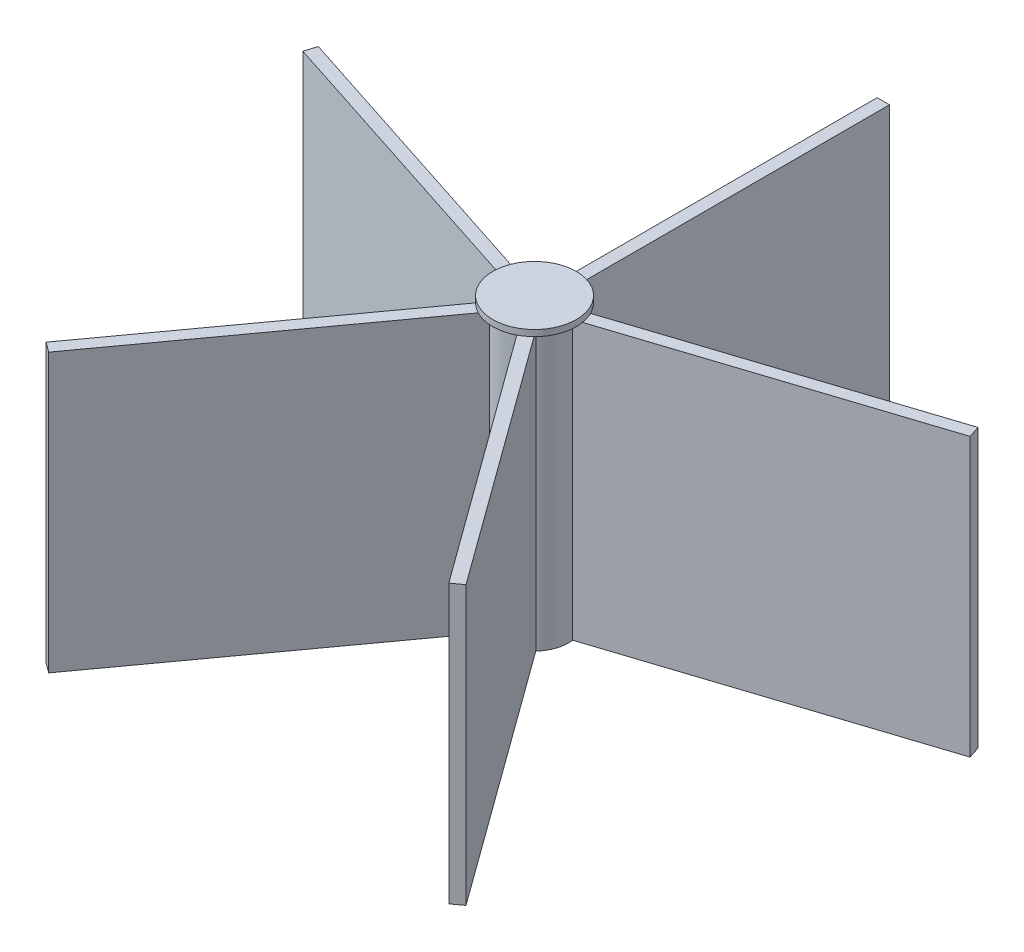
ISO-10303-21;
HEADER;
FILE_DESCRIPTION(('STEP AP214'),'2;1');
FILE_NAME('part.step','',(''),(''),'','','');
FILE_SCHEMA(('AUTOMOTIVE_DESIGN { 1 0 10303 214 1 1 1 1 }'));
ENDSEC;
DATA;
#1=APPLICATION_CONTEXT('core data for automotive mechanical design processes');
#2=APPLICATION_PROTOCOL_DEFINITION('international standard','automotive_design',2000,#1);
#3=PRODUCT_CONTEXT('',#1,'mechanical');
#4=PRODUCT('Part','Part','',(#3));
#5=PRODUCT_RELATED_PRODUCT_CATEGORY('part','',(#4));
#6=PRODUCT_DEFINITION_FORMATION('','',#4);
#7=PRODUCT_DEFINITION_CONTEXT('part definition',#1,'design');
#8=PRODUCT_DEFINITION('design','',#6,#7);
#9=PRODUCT_DEFINITION_SHAPE('','',#8);
#10=(LENGTH_UNIT() NAMED_UNIT(*) SI_UNIT(.MILLI.,.METRE.));
#11=(NAMED_UNIT(*) PLANE_ANGLE_UNIT() SI_UNIT($,.RADIAN.));
#12=(NAMED_UNIT(*) SI_UNIT($,.STERADIAN.) SOLID_ANGLE_UNIT());
#13=UNCERTAINTY_MEASURE_WITH_UNIT(LENGTH_MEASURE(1.E-05),#10,'distance_accuracy_value','');
#14=(GEOMETRIC_REPRESENTATION_CONTEXT(3) GLOBAL_UNCERTAINTY_ASSIGNED_CONTEXT((#13)) GLOBAL_UNIT_ASSIGNED_CONTEXT((#10,
#11,#12)) REPRESENTATION_CONTEXT('',''));
#15=CARTESIAN_POINT('',(0.,0.,0.));
#16=DIRECTION('',(0.,0.,1.));
#17=DIRECTION('',(1.,0.,0.));
#18=AXIS2_PLACEMENT_3D('',#15,#16,#17);
#19=CARTESIAN_POINT('',(0.,56.1860321366573,0.));
#20=DIRECTION('',(0.,1.,0.));
#21=DIRECTION('',(0.,0.,1.));
#22=AXIS2_PLACEMENT_3D('',#19,#20,#21);
#23=PLANE('',#22);
#24=DIRECTION('',(0.587785252292477,0.,0.809016994374944));
#25=VECTOR('',#24,1.);
#26=CARTESIAN_POINT('',(5.18107594453654,56.1860321366573,4.5791868335922));
#27=LINE('',#26,#25);
#28=CARTESIAN_POINT('',(5.98192769029197,56.1860321366573,5.68146469742774));
#29=VERTEX_POINT('',#28);
#30=CARTESIAN_POINT('',(7.10767356079731,56.1860321366573,7.23092096063636));
#31=VERTEX_POINT('',#30);
#32=EDGE_CURVE('E351',#29,#31,#27,.T.);
#33=ORIENTED_EDGE('',*,*,#32,.F.);
#34=CARTESIAN_POINT('',(0.,56.1860321366573,0.));
#35=DIRECTION('',(0.,1.,0.));
#36=DIRECTION('',(0.,0.,1.));
#37=AXIS2_PLACEMENT_3D('',#34,#35,#36);
#38=CIRCLE('',#37,8.25);
#39=CARTESIAN_POINT('',(8.17896232113662,56.1860321366573,-1.08031261652669));
#40=VERTEX_POINT('',#39);
#41=EDGE_CURVE('E273',#29,#40,#38,.T.);
#42=ORIENTED_EDGE('',*,*,#41,.T.);
#43=DIRECTION('',(0.951056516295153,0.,-0.309016994374949));
#44=VECTOR('',#43,1.);
#45=CARTESIAN_POINT('',(6.88315697655467,56.1860321366573,-0.65927993758815));
#46=LINE('',#45,#44);
#47=CARTESIAN_POINT('',(10.0004574023091,56.1860321366573,-1.67215224499099));
#48=VERTEX_POINT('',#47);
#49=EDGE_CURVE('E381',#40,#48,#46,.T.);
#50=ORIENTED_EDGE('',*,*,#49,.T.);
#51=CARTESIAN_POINT('',(0.,56.1860321366573,0.));
#52=DIRECTION('',(0.,1.,0.));
#53=DIRECTION('',(0.,0.,1.));
#54=AXIS2_PLACEMENT_3D('',#51,#52,#53);
#55=CIRCLE('',#54,10.1392919568295);
#56=EDGE_CURVE('E267',#31,#48,#55,.T.);
#57=ORIENTED_EDGE('',*,*,#56,.F.);
#58=EDGE_LOOP('',(#33,#42,#50,#57));
#59=FACE_BOUND('',#58,.T.);
#60=ADVANCED_FACE('F49',(#59),#23,.F.);
#61=DIRECTION('',(0.,0.,-1.));
#62=VECTOR('',#61,1.);
#63=CARTESIAN_POINT('',(-1.50000000000004,56.1860321366573,-6.75));
#64=LINE('',#63,#62);
#65=CARTESIAN_POINT('',(-1.50000000000004,56.1860321366573,-8.11249036979398));
#66=VERTEX_POINT('',#65);
#67=CARTESIAN_POINT('',(-1.50000000000004,56.1860321366573,-10.0277236392826));
#68=VERTEX_POINT('',#67);
#69=EDGE_CURVE('E430',#66,#68,#64,.T.);
#70=ORIENTED_EDGE('',*,*,#69,.F.);
#71=CARTESIAN_POINT('',(-7.25191133801183,56.1860321366573,-3.93348216541224));
#72=VERTEX_POINT('',#71);
#73=EDGE_CURVE('E518',#66,#72,#38,.T.);
#74=ORIENTED_EDGE('',*,*,#73,.T.);
#75=DIRECTION('',(-0.951056516295155,0.,-0.309016994374945));
#76=VECTOR('',#75,1.);
#77=CARTESIAN_POINT('',(-5.95610599342989,56.1860321366573,-3.5124494864737));
#78=LINE('',#77,#76);
#79=CARTESIAN_POINT('',(-9.07340641918431,56.1860321366573,-4.52532179387653));
#80=VERTEX_POINT('',#79);
#81=EDGE_CURVE('E274',#72,#80,#78,.T.);
#82=ORIENTED_EDGE('',*,*,#81,.T.);
#83=EDGE_CURVE('E248',#68,#80,#55,.T.);
#84=ORIENTED_EDGE('',*,*,#83,.F.);
#85=EDGE_LOOP('',(#70,#74,#82,#84));
#86=FACE_BOUND('',#85,.T.);
#87=ADVANCED_FACE('F567',(#86),#23,.F.);
#88=CARTESIAN_POINT('',(7.25191133801178,56.1860321366573,-3.93348216541216));
#89=VERTEX_POINT('',#88);
#90=CARTESIAN_POINT('',(1.49999999999996,56.1860321366573,-8.11249036979398));
#91=VERTEX_POINT('',#90);
#92=EDGE_CURVE('E521',#89,#91,#38,.T.);
#93=ORIENTED_EDGE('',*,*,#92,.T.);
#94=DIRECTION('',(0.,0.,-1.));
#95=VECTOR('',#94,1.);
#96=CARTESIAN_POINT('',(1.49999999999996,56.1860321366573,-6.75));
#97=LINE('',#96,#95);
#98=CARTESIAN_POINT('',(1.49999999999996,56.1860321366573,-10.0277236392826));
#99=VERTEX_POINT('',#98);
#100=EDGE_CURVE('E421',#91,#99,#97,.T.);
#101=ORIENTED_EDGE('',*,*,#100,.T.);
#102=CARTESIAN_POINT('',(9.07340641918426,56.1860321366573,-4.52532179387645));
#103=VERTEX_POINT('',#102);
#104=EDGE_CURVE('E261',#103,#99,#55,.T.);
#105=ORIENTED_EDGE('',*,*,#104,.F.);
#106=DIRECTION('',(0.951056516295153,0.,-0.309016994374949));
#107=VECTOR('',#106,1.);
#108=CARTESIAN_POINT('',(5.95610599342983,56.1860321366573,-3.51244948647361));
#109=LINE('',#108,#107);
#110=EDGE_CURVE('E391',#89,#103,#109,.T.);
#111=ORIENTED_EDGE('',*,*,#110,.F.);
#112=EDGE_LOOP('',(#93,#101,#105,#111));
#113=FACE_BOUND('',#112,.T.);
#114=ADVANCED_FACE('F534',(#113),#23,.F.);
#115=CARTESIAN_POINT('',(-3.55487670716728,56.1860321366573,7.44482045430511));
#116=VERTEX_POINT('',#115);
#117=CARTESIAN_POINT('',(3.55487670716712,56.1860321366573,7.44482045430515));
#118=VERTEX_POINT('',#117);
#119=EDGE_CURVE('E272',#116,#118,#38,.T.);
#120=ORIENTED_EDGE('',*,*,#119,.T.);
#121=DIRECTION('',(0.587785252292477,0.,0.809016994374944));
#122=VECTOR('',#121,1.);
#123=CARTESIAN_POINT('',(2.7540249614117,56.1860321366573,6.34254259046963));
#124=LINE('',#123,#122);
#125=CARTESIAN_POINT('',(4.68062257767247,56.1860321366573,8.99427671751377));
#126=VERTEX_POINT('',#125);
#127=EDGE_CURVE('E341',#118,#126,#124,.T.);
#128=ORIENTED_EDGE('',*,*,#127,.T.);
#129=CARTESIAN_POINT('',(-4.68062257767261,56.1860321366573,8.99427671751375));
#130=VERTEX_POINT('',#129);
#131=EDGE_CURVE('E268',#130,#126,#55,.T.);
#132=ORIENTED_EDGE('',*,*,#131,.F.);
#133=DIRECTION('',(-0.587785252292469,0.,0.809016994374951));
#134=VECTOR('',#133,1.);
#135=CARTESIAN_POINT('',(-2.75402496141186,56.1860321366573,6.34254259046956));
#136=LINE('',#135,#134);
#137=EDGE_CURVE('E311',#116,#130,#136,.T.);
#138=ORIENTED_EDGE('',*,*,#137,.F.);
#139=EDGE_LOOP('',(#120,#128,#132,#138));
#140=FACE_BOUND('',#139,.T.);
#141=ADVANCED_FACE('F501',(#140),#23,.F.);
#142=CARTESIAN_POINT('',(-8.17896232113669,56.1860321366573,-1.08031261652678));
#143=VERTEX_POINT('',#142);
#144=CARTESIAN_POINT('',(-5.98192769029211,56.1860321366573,5.68146469742768));
#145=VERTEX_POINT('',#144);
#146=EDGE_CURVE('E269',#143,#145,#38,.T.);
#147=ORIENTED_EDGE('',*,*,#146,.T.);
#148=DIRECTION('',(-0.587785252292469,0.,0.809016994374951));
#149=VECTOR('',#148,1.);
#150=CARTESIAN_POINT('',(-5.18107594453671,56.1860321366573,4.57918683359215));
#151=LINE('',#150,#149);
#152=CARTESIAN_POINT('',(-7.10767356079745,56.1860321366573,7.23092096063631));
#153=VERTEX_POINT('',#152);
#154=EDGE_CURVE('E244',#145,#153,#151,.T.);
#155=ORIENTED_EDGE('',*,*,#154,.T.);
#156=CARTESIAN_POINT('',(-10.0004574023092,56.1860321366573,-1.67215224499107));
#157=VERTEX_POINT('',#156);
#158=EDGE_CURVE('E241',#157,#153,#55,.T.);
#159=ORIENTED_EDGE('',*,*,#158,.F.);
#160=DIRECTION('',(-0.951056516295155,0.,-0.309016994374945));
#161=VECTOR('',#160,1.);
#162=CARTESIAN_POINT('',(-6.88315697655472,56.1860321366573,-0.659279937588238));
#163=LINE('',#162,#161);
#164=EDGE_CURVE('E217',#143,#157,#163,.T.);
#165=ORIENTED_EDGE('',*,*,#164,.F.);
#166=EDGE_LOOP('',(#147,#155,#159,#165));
#167=FACE_BOUND('',#166,.T.);
#168=ADVANCED_FACE('F242',(#167),#23,.F.);
#169=CARTESIAN_POINT('',(0.,57.6860321366573,0.));
#170=DIRECTION('',(0.,-1.,0.));
#171=DIRECTION('',(0.,0.,-1.));
#172=AXIS2_PLACEMENT_3D('',#169,#170,#171);
#173=CYLINDRICAL_SURFACE('',#172,10.1392919568295);
#174=CARTESIAN_POINT('',(0.,57.6860321366573,0.));
#175=DIRECTION('',(0.,1.,0.));
#176=DIRECTION('',(0.,0.,1.));
#177=AXIS2_PLACEMENT_3D('',#174,#175,#176);
#178=CIRCLE('',#177,10.1392919568295);
#179=CARTESIAN_POINT('',(0.,57.6860321366573,10.1392919568295));
#180=VERTEX_POINT('',#179);
#181=EDGE_CURVE('E266',#180,#180,#178,.T.);
#182=ORIENTED_EDGE('',*,*,#181,.F.);
#183=EDGE_LOOP('',(#182));
#184=FACE_BOUND('',#183,.T.);
#185=EDGE_CURVE('E262',#126,#31,#55,.T.);
#186=ORIENTED_EDGE('',*,*,#185,.T.);
#187=ORIENTED_EDGE('',*,*,#56,.T.);
#188=EDGE_CURVE('E528',#48,#103,#55,.T.);
#189=ORIENTED_EDGE('',*,*,#188,.T.);
#190=ORIENTED_EDGE('',*,*,#104,.T.);
#191=EDGE_CURVE('E66',#99,#68,#55,.T.);
#192=ORIENTED_EDGE('',*,*,#191,.T.);
#193=ORIENTED_EDGE('',*,*,#83,.T.);
#194=CARTESIAN_POINT('',(0.,56.1860321366573,0.));
#195=DIRECTION('',(0.,-1.,0.));
#196=DIRECTION('',(0.,0.,-1.));
#197=AXIS2_PLACEMENT_3D('',#194,#195,#196);
#198=CIRCLE('',#197,10.1392919568295);
#199=EDGE_CURVE('E12',#80,#157,#198,.F.);
#200=ORIENTED_EDGE('',*,*,#199,.T.);
#201=ORIENTED_EDGE('',*,*,#158,.T.);
#202=EDGE_CURVE('E249',#153,#130,#55,.T.);
#203=ORIENTED_EDGE('',*,*,#202,.T.);
#204=ORIENTED_EDGE('',*,*,#131,.T.);
#205=EDGE_LOOP('',(#186,#187,#189,#190,#192,#193,#200,#201,#203,#204));
#206=FACE_BOUND('',#205,.T.);
#207=ADVANCED_FACE('F253',(#184,#206),#173,.T.);
#208=CARTESIAN_POINT('',(0.,57.6860321366573,0.));
#209=DIRECTION('',(0.,1.,0.));
#210=DIRECTION('',(0.,0.,1.));
#211=AXIS2_PLACEMENT_3D('',#208,#209,#210);
#212=PLANE('',#211);
#213=ORIENTED_EDGE('',*,*,#181,.T.);
#214=EDGE_LOOP('',(#213));
#215=FACE_BOUND('',#214,.T.);
#216=ADVANCED_FACE('F577',(#215),#212,.T.);
#217=CARTESIAN_POINT('',(0.,56.1860321366573,0.));
#218=DIRECTION('',(0.,-1.,0.));
#219=DIRECTION('',(0.,0.,-1.));
#220=AXIS2_PLACEMENT_3D('',#217,#218,#219);
#221=CYLINDRICAL_SURFACE('',#220,8.25);
#222=ORIENTED_EDGE('',*,*,#41,.F.);
#223=DIRECTION('',(0.,-1.,0.));
#224=VECTOR('',#223,1.);
#225=CARTESIAN_POINT('',(5.98192769029197,56.1860321366573,5.68146469742774));
#226=LINE('',#225,#224);
#227=CARTESIAN_POINT('',(5.98192769029197,-11.3139678633427,5.68146469742774));
#228=VERTEX_POINT('',#227);
#229=EDGE_CURVE('E372',#29,#228,#226,.T.);
#230=ORIENTED_EDGE('',*,*,#229,.T.);
#231=CARTESIAN_POINT('',(0.,-11.3139678633427,0.));
#232=DIRECTION('',(0.,1.,0.));
#233=DIRECTION('',(1.,0.,0.));
#234=AXIS2_PLACEMENT_3D('',#231,#232,#233);
#235=CIRCLE('',#234,8.25);
#236=CARTESIAN_POINT('',(8.17896232113662,-11.3139678633427,-1.08031261652669));
#237=VERTEX_POINT('',#236);
#238=EDGE_CURVE('E472',#228,#237,#235,.T.);
#239=ORIENTED_EDGE('',*,*,#238,.T.);
#240=DIRECTION('',(0.,-1.,0.));
#241=VECTOR('',#240,1.);
#242=CARTESIAN_POINT('',(8.17896232113662,56.1860321366573,-1.08031261652669));
#243=LINE('',#242,#241);
#244=EDGE_CURVE('E416',#40,#237,#243,.T.);
#245=ORIENTED_EDGE('',*,*,#244,.F.);
#246=EDGE_LOOP('',(#222,#230,#239,#245));
#247=FACE_BOUND('',#246,.T.);
#248=ADVANCED_FACE('F51',(#247),#221,.T.);
#249=ORIENTED_EDGE('',*,*,#92,.F.);
#250=DIRECTION('',(0.,-1.,0.));
#251=VECTOR('',#250,1.);
#252=CARTESIAN_POINT('',(7.25191133801178,56.1860321366573,-3.93348216541216));
#253=LINE('',#252,#251);
#254=CARTESIAN_POINT('',(7.25191133801178,-11.3139678633427,-3.93348216541216));
#255=VERTEX_POINT('',#254);
#256=EDGE_CURVE('E412',#89,#255,#253,.T.);
#257=ORIENTED_EDGE('',*,*,#256,.T.);
#258=CARTESIAN_POINT('',(1.49999999999996,-11.3139678633427,-8.11249036979398));
#259=VERTEX_POINT('',#258);
#260=EDGE_CURVE('E463',#255,#259,#235,.T.);
#261=ORIENTED_EDGE('',*,*,#260,.T.);
#262=DIRECTION('',(0.,-1.,0.));
#263=VECTOR('',#262,1.);
#264=CARTESIAN_POINT('',(1.49999999999996,56.1860321366573,-8.11249036979398));
#265=LINE('',#264,#263);
#266=EDGE_CURVE('E454',#91,#259,#265,.T.);
#267=ORIENTED_EDGE('',*,*,#266,.F.);
#268=EDGE_LOOP('',(#249,#257,#261,#267));
#269=FACE_BOUND('',#268,.T.);
#270=ADVANCED_FACE('F655',(#269),#221,.T.);
#271=ORIENTED_EDGE('',*,*,#73,.F.);
#272=DIRECTION('',(0.,-1.,0.));
#273=VECTOR('',#272,1.);
#274=CARTESIAN_POINT('',(-1.50000000000004,56.1860321366573,-8.11249036979398));
#275=LINE('',#274,#273);
#276=CARTESIAN_POINT('',(-1.50000000000004,-11.3139678633427,-8.11249036979398));
#277=VERTEX_POINT('',#276);
#278=EDGE_CURVE('E450',#66,#277,#275,.T.);
#279=ORIENTED_EDGE('',*,*,#278,.T.);
#280=CARTESIAN_POINT('',(-7.25191133801183,-11.3139678633427,-3.93348216541224));
#281=VERTEX_POINT('',#280);
#282=EDGE_CURVE('E59',#277,#281,#235,.T.);
#283=ORIENTED_EDGE('',*,*,#282,.T.);
#284=DIRECTION('',(0.,-1.,0.));
#285=VECTOR('',#284,1.);
#286=CARTESIAN_POINT('',(-7.25191133801182,56.1860321366573,-3.93348216541224));
#287=LINE('',#286,#285);
#288=EDGE_CURVE('E298',#72,#281,#287,.T.);
#289=ORIENTED_EDGE('',*,*,#288,.F.);
#290=EDGE_LOOP('',(#271,#279,#283,#289));
#291=FACE_BOUND('',#290,.T.);
#292=ADVANCED_FACE('F562',(#291),#221,.T.);
#293=ORIENTED_EDGE('',*,*,#146,.F.);
#294=DIRECTION('',(0.,-1.,0.));
#295=VECTOR('',#294,1.);
#296=CARTESIAN_POINT('',(-8.17896232113669,56.1860321366573,-1.08031261652678));
#297=LINE('',#296,#295);
#298=CARTESIAN_POINT('',(-8.17896232113669,-11.3139678633427,-1.08031261652678));
#299=VERTEX_POINT('',#298);
#300=EDGE_CURVE('E225',#143,#299,#297,.T.);
#301=ORIENTED_EDGE('',*,*,#300,.T.);
#302=CARTESIAN_POINT('',(-5.98192769029211,-11.3139678633427,5.68146469742768));
#303=VERTEX_POINT('',#302);
#304=EDGE_CURVE('E467',#299,#303,#235,.T.);
#305=ORIENTED_EDGE('',*,*,#304,.T.);
#306=DIRECTION('',(0.,-1.,0.));
#307=VECTOR('',#306,1.);
#308=CARTESIAN_POINT('',(-5.98192769029211,56.1860321366573,5.68146469742767));
#309=LINE('',#308,#307);
#310=EDGE_CURVE('E336',#145,#303,#309,.T.);
#311=ORIENTED_EDGE('',*,*,#310,.F.);
#312=EDGE_LOOP('',(#293,#301,#305,#311));
#313=FACE_BOUND('',#312,.T.);
#314=ADVANCED_FACE('F553',(#313),#221,.T.);
#315=ORIENTED_EDGE('',*,*,#119,.F.);
#316=DIRECTION('',(0.,-1.,0.));
#317=VECTOR('',#316,1.);
#318=CARTESIAN_POINT('',(-3.55487670716728,56.1860321366573,7.44482045430511));
#319=LINE('',#318,#317);
#320=CARTESIAN_POINT('',(-3.55487670716728,-11.3139678633427,7.44482045430511));
#321=VERTEX_POINT('',#320);
#322=EDGE_CURVE('E332',#116,#321,#319,.T.);
#323=ORIENTED_EDGE('',*,*,#322,.T.);
#324=CARTESIAN_POINT('',(3.55487670716712,-11.3139678633427,7.44482045430515));
#325=VERTEX_POINT('',#324);
#326=EDGE_CURVE('E470',#321,#325,#235,.T.);
#327=ORIENTED_EDGE('',*,*,#326,.T.);
#328=DIRECTION('',(0.,-1.,0.));
#329=VECTOR('',#328,1.);
#330=CARTESIAN_POINT('',(3.55487670716712,56.1860321366573,7.44482045430515));
#331=LINE('',#330,#329);
#332=EDGE_CURVE('E376',#118,#325,#331,.T.);
#333=ORIENTED_EDGE('',*,*,#332,.F.);
#334=EDGE_LOOP('',(#315,#323,#327,#333));
#335=FACE_BOUND('',#334,.T.);
#336=ADVANCED_FACE('F478',(#335),#221,.T.);
#337=CARTESIAN_POINT('',(0.,-11.3139678633427,0.));
#338=DIRECTION('',(0.,1.,0.));
#339=DIRECTION('',(0.,0.,1.));
#340=AXIS2_PLACEMENT_3D('',#337,#338,#339);
#341=PLANE('',#340);
#342=ORIENTED_EDGE('',*,*,#304,.F.);
#343=DIRECTION('',(-0.951056516295155,0.,-0.309016994374945));
#344=VECTOR('',#343,1.);
#345=CARTESIAN_POINT('',(-6.88315697655472,-11.3139678633427,-0.659279937588238));
#346=LINE('',#345,#344);
#347=CARTESIAN_POINT('',(-81.0655652475766,-11.3139678633427,-24.7626054988339));
#348=VERTEX_POINT('',#347);
#349=EDGE_CURVE('E287',#299,#348,#346,.T.);
#350=ORIENTED_EDGE('',*,*,#349,.T.);
#351=DIRECTION('',(0.309016994374946,0.,-0.951056516295154));
#352=VECTOR('',#351,1.);
#353=CARTESIAN_POINT('',(-81.0655652475766,-11.3139678633427,-24.7626054988339));
#354=LINE('',#353,#352);
#355=CARTESIAN_POINT('',(-80.1385142644518,-11.3139678633427,-27.6157750477193));
#356=VERTEX_POINT('',#355);
#357=EDGE_CURVE('E283',#348,#356,#354,.T.);
#358=ORIENTED_EDGE('',*,*,#357,.T.);
#359=DIRECTION('',(-0.951056516295155,0.,-0.309016994374945));
#360=VECTOR('',#359,1.);
#361=CARTESIAN_POINT('',(-5.95610599342989,-11.3139678633427,-3.5124494864737));
#362=LINE('',#361,#360);
#363=EDGE_CURVE('E280',#281,#356,#362,.T.);
#364=ORIENTED_EDGE('',*,*,#363,.F.);
#365=ORIENTED_EDGE('',*,*,#282,.F.);
#366=DIRECTION('',(0.,0.,-1.));
#367=VECTOR('',#366,1.);
#368=CARTESIAN_POINT('',(-1.50000000000004,-11.3139678633427,-6.75));
#369=LINE('',#368,#367);
#370=CARTESIAN_POINT('',(-1.50000000000004,-11.3139678633427,-84.75));
#371=VERTEX_POINT('',#370);
#372=EDGE_CURVE('E440',#277,#371,#369,.T.);
#373=ORIENTED_EDGE('',*,*,#372,.T.);
#374=DIRECTION('',(1.,0.,0.));
#375=VECTOR('',#374,1.);
#376=CARTESIAN_POINT('',(-1.50000000000004,-11.3139678633427,-84.75));
#377=LINE('',#376,#375);
#378=CARTESIAN_POINT('',(1.49999999999996,-11.3139678633427,-84.75));
#379=VERTEX_POINT('',#378);
#380=EDGE_CURVE('E436',#371,#379,#377,.T.);
#381=ORIENTED_EDGE('',*,*,#380,.T.);
#382=DIRECTION('',(0.,0.,-1.));
#383=VECTOR('',#382,1.);
#384=CARTESIAN_POINT('',(1.49999999999996,-11.3139678633427,-6.75));
#385=LINE('',#384,#383);
#386=EDGE_CURVE('E420',#259,#379,#385,.T.);
#387=ORIENTED_EDGE('',*,*,#386,.F.);
#388=ORIENTED_EDGE('',*,*,#260,.F.);
#389=DIRECTION('',(0.951056516295153,0.,-0.309016994374949));
#390=VECTOR('',#389,1.);
#391=CARTESIAN_POINT('',(5.95610599342983,-11.3139678633427,-3.51244948647361));
#392=LINE('',#391,#390);
#393=CARTESIAN_POINT('',(80.1385142644519,-11.3139678633427,-27.6157750477197));
#394=VERTEX_POINT('',#393);
#395=EDGE_CURVE('E402',#255,#394,#392,.T.);
#396=ORIENTED_EDGE('',*,*,#395,.T.);
#397=DIRECTION('',(0.309016994374949,0.,0.951056516295153));
#398=VECTOR('',#397,1.);
#399=CARTESIAN_POINT('',(80.1385142644519,-11.3139678633427,-27.6157750477197));
#400=LINE('',#399,#398);
#401=CARTESIAN_POINT('',(81.0655652475768,-11.3139678633427,-24.7626054988342));
#402=VERTEX_POINT('',#401);
#403=EDGE_CURVE('E398',#394,#402,#400,.T.);
#404=ORIENTED_EDGE('',*,*,#403,.T.);
#405=DIRECTION('',(0.951056516295153,0.,-0.309016994374949));
#406=VECTOR('',#405,1.);
#407=CARTESIAN_POINT('',(6.88315697655467,-11.3139678633427,-0.65927993758815));
#408=LINE('',#407,#406);
#409=EDGE_CURVE('E380',#237,#402,#408,.T.);
#410=ORIENTED_EDGE('',*,*,#409,.F.);
#411=ORIENTED_EDGE('',*,*,#238,.F.);
#412=DIRECTION('',(0.587785252292477,0.,0.809016994374944));
#413=VECTOR('',#412,1.);
#414=CARTESIAN_POINT('',(5.18107594453654,-11.3139678633427,4.5791868335922));
#415=LINE('',#414,#413);
#416=CARTESIAN_POINT('',(51.0283256233498,-11.3139678633427,67.6825123948379));
#417=VERTEX_POINT('',#416);
#418=EDGE_CURVE('E362',#228,#417,#415,.T.);
#419=ORIENTED_EDGE('',*,*,#418,.T.);
#420=DIRECTION('',(-0.809016994374945,0.,0.587785252292477));
#421=VECTOR('',#420,1.);
#422=CARTESIAN_POINT('',(51.0283256233498,-11.3139678633427,67.6825123948379));
#423=LINE('',#422,#421);
#424=CARTESIAN_POINT('',(48.601274640225,-11.3139678633427,69.4458681517154));
#425=VERTEX_POINT('',#424);
#426=EDGE_CURVE('E358',#417,#425,#423,.T.);
#427=ORIENTED_EDGE('',*,*,#426,.T.);
#428=DIRECTION('',(0.587785252292477,0.,0.809016994374944));
#429=VECTOR('',#428,1.);
#430=CARTESIAN_POINT('',(2.7540249614117,-11.3139678633427,6.34254259046963));
#431=LINE('',#430,#429);
#432=EDGE_CURVE('E340',#325,#425,#431,.T.);
#433=ORIENTED_EDGE('',*,*,#432,.F.);
#434=ORIENTED_EDGE('',*,*,#326,.F.);
#435=DIRECTION('',(-0.587785252292469,0.,0.809016994374951));
#436=VECTOR('',#435,1.);
#437=CARTESIAN_POINT('',(-2.75402496141186,-11.3139678633427,6.34254259046956));
#438=LINE('',#437,#436);
#439=CARTESIAN_POINT('',(-48.6012746402244,-11.3139678633427,69.4458681517156));
#440=VERTEX_POINT('',#439);
#441=EDGE_CURVE('E322',#321,#440,#438,.T.);
#442=ORIENTED_EDGE('',*,*,#441,.T.);
#443=DIRECTION('',(-0.809016994374952,0.,-0.587785252292467));
#444=VECTOR('',#443,1.);
#445=CARTESIAN_POINT('',(-48.6012746402244,-11.3139678633427,69.4458681517156));
#446=LINE('',#445,#444);
#447=CARTESIAN_POINT('',(-51.0283256233492,-11.3139678633427,67.6825123948382));
#448=VERTEX_POINT('',#447);
#449=EDGE_CURVE('E318',#440,#448,#446,.T.);
#450=ORIENTED_EDGE('',*,*,#449,.T.);
#451=DIRECTION('',(-0.587785252292469,0.,0.809016994374951));
#452=VECTOR('',#451,1.);
#453=CARTESIAN_POINT('',(-5.18107594453671,-11.3139678633427,4.57918683359215));
#454=LINE('',#453,#452);
#455=EDGE_CURVE('E302',#303,#448,#454,.T.);
#456=ORIENTED_EDGE('',*,*,#455,.F.);
#457=EDGE_LOOP('',(#342,#350,#358,#364,#365,#373,#381,#387,#388,#396,#404,#410,#411,#419,#427,
#433,#434,#442,#450,#456));
#458=FACE_BOUND('',#457,.T.);
#459=ADVANCED_FACE('F489',(#458),#341,.F.);
#460=CARTESIAN_POINT('',(1.49999999999996,56.1860321366573,-6.75));
#461=DIRECTION('',(-1.,0.,0.));
#462=DIRECTION('',(0.,0.,1.));
#463=AXIS2_PLACEMENT_3D('',#460,#461,#462);
#464=PLANE('',#463);
#465=ORIENTED_EDGE('',*,*,#100,.F.);
#466=ORIENTED_EDGE('',*,*,#266,.T.);
#467=ORIENTED_EDGE('',*,*,#386,.T.);
#468=DIRECTION('',(0.,-1.,0.));
#469=VECTOR('',#468,1.);
#470=CARTESIAN_POINT('',(1.49999999999996,56.1860321366573,-84.75));
#471=LINE('',#470,#469);
#472=CARTESIAN_POINT('',(1.49999999999996,56.1860321366573,-84.75));
#473=VERTEX_POINT('',#472);
#474=EDGE_CURVE('E446',#473,#379,#471,.T.);
#475=ORIENTED_EDGE('',*,*,#474,.F.);
#476=EDGE_CURVE('E426',#99,#473,#97,.T.);
#477=ORIENTED_EDGE('',*,*,#476,.F.);
#478=EDGE_LOOP('',(#465,#466,#467,#475,#477));
#479=FACE_BOUND('',#478,.T.);
#480=ADVANCED_FACE('F537',(#479),#464,.F.);
#481=CARTESIAN_POINT('',(-1.50000000000004,56.1860321366573,-6.75));
#482=DIRECTION('',(-1.,0.,0.));
#483=DIRECTION('',(0.,0.,1.));
#484=AXIS2_PLACEMENT_3D('',#481,#482,#483);
#485=PLANE('',#484);
#486=ORIENTED_EDGE('',*,*,#278,.F.);
#487=ORIENTED_EDGE('',*,*,#69,.T.);
#488=CARTESIAN_POINT('',(-1.50000000000004,56.1860321366573,-84.75));
#489=VERTEX_POINT('',#488);
#490=EDGE_CURVE('E71',#68,#489,#64,.T.);
#491=ORIENTED_EDGE('',*,*,#490,.T.);
#492=DIRECTION('',(0.,-1.,0.));
#493=VECTOR('',#492,1.);
#494=CARTESIAN_POINT('',(-1.50000000000004,56.1860321366573,-84.75));
#495=LINE('',#494,#493);
#496=EDGE_CURVE('E433',#489,#371,#495,.T.);
#497=ORIENTED_EDGE('',*,*,#496,.T.);
#498=ORIENTED_EDGE('',*,*,#372,.F.);
#499=EDGE_LOOP('',(#486,#487,#491,#497,#498));
#500=FACE_BOUND('',#499,.T.);
#501=ADVANCED_FACE('F566',(#500),#485,.T.);
#502=CARTESIAN_POINT('',(-1.50000000000004,56.1860321366573,-84.75));
#503=DIRECTION('',(0.,0.,-1.));
#504=DIRECTION('',(-1.,0.,0.));
#505=AXIS2_PLACEMENT_3D('',#502,#503,#504);
#506=PLANE('',#505);
#507=ORIENTED_EDGE('',*,*,#380,.F.);
#508=ORIENTED_EDGE('',*,*,#496,.F.);
#509=DIRECTION('',(1.,0.,0.));
#510=VECTOR('',#509,1.);
#511=CARTESIAN_POINT('',(-1.50000000000004,56.1860321366573,-84.75));
#512=LINE('',#511,#510);
#513=EDGE_CURVE('E425',#489,#473,#512,.T.);
#514=ORIENTED_EDGE('',*,*,#513,.T.);
#515=ORIENTED_EDGE('',*,*,#474,.T.);
#516=EDGE_LOOP('',(#507,#508,#514,#515));
#517=FACE_BOUND('',#516,.T.);
#518=ADVANCED_FACE('F627',(#517),#506,.T.);
#519=CARTESIAN_POINT('',(0.,56.1860321366573,0.));
#520=DIRECTION('',(0.,-1.,0.));
#521=DIRECTION('',(-1.,0.,0.));
#522=AXIS2_PLACEMENT_3D('',#519,#520,#521);
#523=PLANE('',#522);
#524=ORIENTED_EDGE('',*,*,#191,.F.);
#525=ORIENTED_EDGE('',*,*,#476,.T.);
#526=ORIENTED_EDGE('',*,*,#513,.F.);
#527=ORIENTED_EDGE('',*,*,#490,.F.);
#528=EDGE_LOOP('',(#524,#525,#526,#527));
#529=FACE_BOUND('',#528,.T.);
#530=ADVANCED_FACE('F623',(#529),#523,.F.);
#531=CARTESIAN_POINT('',(6.88315697655467,56.1860321366573,-0.65927993758815));
#532=DIRECTION('',(-0.309016994374949,0.,-0.951056516295153));
#533=DIRECTION('',(-0.951056516295153,0.,0.309016994374949));
#534=AXIS2_PLACEMENT_3D('',#531,#532,#533);
#535=PLANE('',#534);
#536=ORIENTED_EDGE('',*,*,#49,.F.);
#537=ORIENTED_EDGE('',*,*,#244,.T.);
#538=ORIENTED_EDGE('',*,*,#409,.T.);
#539=DIRECTION('',(0.,-1.,0.));
#540=VECTOR('',#539,1.);
#541=CARTESIAN_POINT('',(81.0655652475768,56.1860321366573,-24.7626054988342));
#542=LINE('',#541,#540);
#543=CARTESIAN_POINT('',(81.0655652475768,56.1860321366573,-24.7626054988342));
#544=VERTEX_POINT('',#543);
#545=EDGE_CURVE('E408',#544,#402,#542,.T.);
#546=ORIENTED_EDGE('',*,*,#545,.F.);
#547=EDGE_CURVE('E386',#48,#544,#46,.T.);
#548=ORIENTED_EDGE('',*,*,#547,.F.);
#549=EDGE_LOOP('',(#536,#537,#538,#546,#548));
#550=FACE_BOUND('',#549,.T.);
#551=ADVANCED_FACE('F616',(#550),#535,.F.);
#552=CARTESIAN_POINT('',(5.95610599342983,56.1860321366573,-3.51244948647361));
#553=DIRECTION('',(-0.309016994374949,0.,-0.951056516295153));
#554=DIRECTION('',(-0.951056516295153,0.,0.309016994374949));
#555=AXIS2_PLACEMENT_3D('',#552,#553,#554);
#556=PLANE('',#555);
#557=ORIENTED_EDGE('',*,*,#256,.F.);
#558=ORIENTED_EDGE('',*,*,#110,.T.);
#559=CARTESIAN_POINT('',(80.1385142644519,56.1860321366573,-27.6157750477197));
#560=VERTEX_POINT('',#559);
#561=EDGE_CURVE('E390',#103,#560,#109,.T.);
#562=ORIENTED_EDGE('',*,*,#561,.T.);
#563=DIRECTION('',(0.,-1.,0.));
#564=VECTOR('',#563,1.);
#565=CARTESIAN_POINT('',(80.1385142644519,56.1860321366573,-27.6157750477197));
#566=LINE('',#565,#564);
#567=EDGE_CURVE('E395',#560,#394,#566,.T.);
#568=ORIENTED_EDGE('',*,*,#567,.T.);
#569=ORIENTED_EDGE('',*,*,#395,.F.);
#570=EDGE_LOOP('',(#557,#558,#562,#568,#569));
#571=FACE_BOUND('',#570,.T.);
#572=ADVANCED_FACE('F613',(#571),#556,.T.);
#573=CARTESIAN_POINT('',(80.1385142644519,56.1860321366573,-27.6157750477197));
#574=DIRECTION('',(0.951056516295153,0.,-0.309016994374949));
#575=DIRECTION('',(-0.309016994374949,0.,-0.951056516295153));
#576=AXIS2_PLACEMENT_3D('',#573,#574,#575);
#577=PLANE('',#576);
#578=ORIENTED_EDGE('',*,*,#403,.F.);
#579=ORIENTED_EDGE('',*,*,#567,.F.);
#580=DIRECTION('',(0.309016994374949,0.,0.951056516295153));
#581=VECTOR('',#580,1.);
#582=CARTESIAN_POINT('',(80.1385142644519,56.1860321366573,-27.6157750477197));
#583=LINE('',#582,#581);
#584=EDGE_CURVE('E385',#560,#544,#583,.T.);
#585=ORIENTED_EDGE('',*,*,#584,.T.);
#586=ORIENTED_EDGE('',*,*,#545,.T.);
#587=EDGE_LOOP('',(#578,#579,#585,#586));
#588=FACE_BOUND('',#587,.T.);
#589=ADVANCED_FACE('F611',(#588),#577,.T.);
#590=CARTESIAN_POINT('',(0.,56.1860321366573,0.));
#591=DIRECTION('',(0.,-1.,0.));
#592=DIRECTION('',(-1.,0.,0.));
#593=AXIS2_PLACEMENT_3D('',#590,#591,#592);
#594=PLANE('',#593);
#595=ORIENTED_EDGE('',*,*,#188,.F.);
#596=ORIENTED_EDGE('',*,*,#547,.T.);
#597=ORIENTED_EDGE('',*,*,#584,.F.);
#598=ORIENTED_EDGE('',*,*,#561,.F.);
#599=EDGE_LOOP('',(#595,#596,#597,#598));
#600=FACE_BOUND('',#599,.T.);
#601=ADVANCED_FACE('F608',(#600),#594,.F.);
#602=CARTESIAN_POINT('',(2.7540249614117,56.1860321366573,6.34254259046963));
#603=DIRECTION('',(0.809016994374944,0.,-0.587785252292477));
#604=DIRECTION('',(-0.587785252292477,0.,-0.809016994374944));
#605=AXIS2_PLACEMENT_3D('',#602,#603,#604);
#606=PLANE('',#605);
#607=ORIENTED_EDGE('',*,*,#127,.F.);
#608=ORIENTED_EDGE('',*,*,#332,.T.);
#609=ORIENTED_EDGE('',*,*,#432,.T.);
#610=DIRECTION('',(0.,-1.,0.));
#611=VECTOR('',#610,1.);
#612=CARTESIAN_POINT('',(48.601274640225,56.1860321366573,69.4458681517154));
#613=LINE('',#612,#611);
#614=CARTESIAN_POINT('',(48.601274640225,56.1860321366573,69.4458681517154));
#615=VERTEX_POINT('',#614);
#616=EDGE_CURVE('E368',#615,#425,#613,.T.);
#617=ORIENTED_EDGE('',*,*,#616,.F.);
#618=EDGE_CURVE('E346',#126,#615,#124,.T.);
#619=ORIENTED_EDGE('',*,*,#618,.F.);
#620=EDGE_LOOP('',(#607,#608,#609,#617,#619));
#621=FACE_BOUND('',#620,.T.);
#622=ADVANCED_FACE('F485',(#621),#606,.F.);
#623=CARTESIAN_POINT('',(5.18107594453654,56.1860321366573,4.5791868335922));
#624=DIRECTION('',(0.809016994374944,0.,-0.587785252292477));
#625=DIRECTION('',(-0.587785252292477,0.,-0.809016994374944));
#626=AXIS2_PLACEMENT_3D('',#623,#624,#625);
#627=PLANE('',#626);
#628=ORIENTED_EDGE('',*,*,#229,.F.);
#629=ORIENTED_EDGE('',*,*,#32,.T.);
#630=CARTESIAN_POINT('',(51.0283256233498,56.1860321366573,67.6825123948379));
#631=VERTEX_POINT('',#630);
#632=EDGE_CURVE('E350',#31,#631,#27,.T.);
#633=ORIENTED_EDGE('',*,*,#632,.T.);
#634=DIRECTION('',(0.,-1.,0.));
#635=VECTOR('',#634,1.);
#636=CARTESIAN_POINT('',(51.0283256233498,56.1860321366573,67.6825123948379));
#637=LINE('',#636,#635);
#638=EDGE_CURVE('E355',#631,#417,#637,.T.);
#639=ORIENTED_EDGE('',*,*,#638,.T.);
#640=ORIENTED_EDGE('',*,*,#418,.F.);
#641=EDGE_LOOP('',(#628,#629,#633,#639,#640));
#642=FACE_BOUND('',#641,.T.);
#643=ADVANCED_FACE('F600',(#642),#627,.T.);
#644=CARTESIAN_POINT('',(51.0283256233498,56.1860321366573,67.6825123948379));
#645=DIRECTION('',(0.587785252292477,0.,0.809016994374945));
#646=DIRECTION('',(0.809016994374945,0.,-0.587785252292477));
#647=AXIS2_PLACEMENT_3D('',#644,#645,#646);
#648=PLANE('',#647);
#649=ORIENTED_EDGE('',*,*,#426,.F.);
#650=ORIENTED_EDGE('',*,*,#638,.F.);
#651=DIRECTION('',(-0.809016994374945,0.,0.587785252292477));
#652=VECTOR('',#651,1.);
#653=CARTESIAN_POINT('',(51.0283256233498,56.1860321366573,67.6825123948379));
#654=LINE('',#653,#652);
#655=EDGE_CURVE('E345',#631,#615,#654,.T.);
#656=ORIENTED_EDGE('',*,*,#655,.T.);
#657=ORIENTED_EDGE('',*,*,#616,.T.);
#658=EDGE_LOOP('',(#649,#650,#656,#657));
#659=FACE_BOUND('',#658,.T.);
#660=ADVANCED_FACE('F494',(#659),#648,.T.);
#661=CARTESIAN_POINT('',(0.,56.1860321366573,0.));
#662=DIRECTION('',(0.,-1.,0.));
#663=DIRECTION('',(-1.,0.,0.));
#664=AXIS2_PLACEMENT_3D('',#661,#662,#663);
#665=PLANE('',#664);
#666=ORIENTED_EDGE('',*,*,#185,.F.);
#667=ORIENTED_EDGE('',*,*,#618,.T.);
#668=ORIENTED_EDGE('',*,*,#655,.F.);
#669=ORIENTED_EDGE('',*,*,#632,.F.);
#670=EDGE_LOOP('',(#666,#667,#668,#669));
#671=FACE_BOUND('',#670,.T.);
#672=ADVANCED_FACE('F597',(#671),#665,.F.);
#673=CARTESIAN_POINT('',(-5.18107594453671,56.1860321366573,4.57918683359215));
#674=DIRECTION('',(0.80901699437495,0.,0.587785252292469));
#675=DIRECTION('',(0.587785252292469,0.,-0.809016994374951));
#676=AXIS2_PLACEMENT_3D('',#673,#674,#675);
#677=PLANE('',#676);
#678=ORIENTED_EDGE('',*,*,#154,.F.);
#679=ORIENTED_EDGE('',*,*,#310,.T.);
#680=ORIENTED_EDGE('',*,*,#455,.T.);
#681=DIRECTION('',(0.,-1.,0.));
#682=VECTOR('',#681,1.);
#683=CARTESIAN_POINT('',(-51.0283256233492,56.1860321366573,67.6825123948382));
#684=LINE('',#683,#682);
#685=CARTESIAN_POINT('',(-51.0283256233492,56.1860321366573,67.6825123948382));
#686=VERTEX_POINT('',#685);
#687=EDGE_CURVE('E328',#686,#448,#684,.T.);
#688=ORIENTED_EDGE('',*,*,#687,.F.);
#689=EDGE_CURVE('E306',#153,#686,#151,.T.);
#690=ORIENTED_EDGE('',*,*,#689,.F.);
#691=EDGE_LOOP('',(#678,#679,#680,#688,#690));
#692=FACE_BOUND('',#691,.T.);
#693=ADVANCED_FACE('F512',(#692),#677,.F.);
#694=CARTESIAN_POINT('',(-2.75402496141186,56.1860321366573,6.34254259046956));
#695=DIRECTION('',(0.80901699437495,0.,0.587785252292469));
#696=DIRECTION('',(0.587785252292469,0.,-0.809016994374951));
#697=AXIS2_PLACEMENT_3D('',#694,#695,#696);
#698=PLANE('',#697);
#699=ORIENTED_EDGE('',*,*,#322,.F.);
#700=ORIENTED_EDGE('',*,*,#137,.T.);
#701=CARTESIAN_POINT('',(-48.6012746402244,56.1860321366573,69.4458681517156));
#702=VERTEX_POINT('',#701);
#703=EDGE_CURVE('E310',#130,#702,#136,.T.);
#704=ORIENTED_EDGE('',*,*,#703,.T.);
#705=DIRECTION('',(0.,-1.,0.));
#706=VECTOR('',#705,1.);
#707=CARTESIAN_POINT('',(-48.6012746402244,56.1860321366573,69.4458681517156));
#708=LINE('',#707,#706);
#709=EDGE_CURVE('E315',#702,#440,#708,.T.);
#710=ORIENTED_EDGE('',*,*,#709,.T.);
#711=ORIENTED_EDGE('',*,*,#441,.F.);
#712=EDGE_LOOP('',(#699,#700,#704,#710,#711));
#713=FACE_BOUND('',#712,.T.);
#714=ADVANCED_FACE('F547',(#713),#698,.T.);
#715=CARTESIAN_POINT('',(-48.6012746402244,56.1860321366573,69.4458681517156));
#716=DIRECTION('',(-0.587785252292467,0.,0.809016994374952));
#717=DIRECTION('',(0.809016994374952,0.,0.587785252292467));
#718=AXIS2_PLACEMENT_3D('',#715,#716,#717);
#719=PLANE('',#718);
#720=ORIENTED_EDGE('',*,*,#449,.F.);
#721=ORIENTED_EDGE('',*,*,#709,.F.);
#722=DIRECTION('',(-0.809016994374952,0.,-0.587785252292467));
#723=VECTOR('',#722,1.);
#724=CARTESIAN_POINT('',(-48.6012746402244,56.1860321366573,69.4458681517156));
#725=LINE('',#724,#723);
#726=EDGE_CURVE('E305',#702,#686,#725,.T.);
#727=ORIENTED_EDGE('',*,*,#726,.T.);
#728=ORIENTED_EDGE('',*,*,#687,.T.);
#729=EDGE_LOOP('',(#720,#721,#727,#728));
#730=FACE_BOUND('',#729,.T.);
#731=ADVANCED_FACE('F550',(#730),#719,.T.);
#732=CARTESIAN_POINT('',(0.,56.1860321366573,0.));
#733=DIRECTION('',(0.,-1.,0.));
#734=DIRECTION('',(-1.,0.,0.));
#735=AXIS2_PLACEMENT_3D('',#732,#733,#734);
#736=PLANE('',#735);
#737=ORIENTED_EDGE('',*,*,#202,.F.);
#738=ORIENTED_EDGE('',*,*,#689,.T.);
#739=ORIENTED_EDGE('',*,*,#726,.F.);
#740=ORIENTED_EDGE('',*,*,#703,.F.);
#741=EDGE_LOOP('',(#737,#738,#739,#740));
#742=FACE_BOUND('',#741,.T.);
#743=ADVANCED_FACE('F508',(#742),#736,.F.);
#744=CARTESIAN_POINT('',(-5.95610599342989,56.1860321366573,-3.5124494864737));
#745=DIRECTION('',(-0.309016994374945,0.,0.951056516295154));
#746=DIRECTION('',(0.951056516295155,0.,0.309016994374945));
#747=AXIS2_PLACEMENT_3D('',#744,#745,#746);
#748=PLANE('',#747);
#749=ORIENTED_EDGE('',*,*,#81,.F.);
#750=ORIENTED_EDGE('',*,*,#288,.T.);
#751=ORIENTED_EDGE('',*,*,#363,.T.);
#752=DIRECTION('',(0.,-1.,0.));
#753=VECTOR('',#752,1.);
#754=CARTESIAN_POINT('',(-80.1385142644518,56.1860321366573,-27.6157750477193));
#755=LINE('',#754,#753);
#756=CARTESIAN_POINT('',(-80.1385142644518,56.1860321366573,-27.6157750477193));
#757=VERTEX_POINT('',#756);
#758=EDGE_CURVE('E292',#757,#356,#755,.T.);
#759=ORIENTED_EDGE('',*,*,#758,.F.);
#760=EDGE_CURVE('E277',#80,#757,#78,.T.);
#761=ORIENTED_EDGE('',*,*,#760,.F.);
#762=EDGE_LOOP('',(#749,#750,#751,#759,#761));
#763=FACE_BOUND('',#762,.T.);
#764=ADVANCED_FACE('F561',(#763),#748,.F.);
#765=CARTESIAN_POINT('',(-6.88315697655472,56.1860321366573,-0.659279937588238));
#766=DIRECTION('',(-0.309016994374945,0.,0.951056516295154));
#767=DIRECTION('',(0.951056516295155,0.,0.309016994374945));
#768=AXIS2_PLACEMENT_3D('',#765,#766,#767);
#769=PLANE('',#768);
#770=ORIENTED_EDGE('',*,*,#300,.F.);
#771=ORIENTED_EDGE('',*,*,#164,.T.);
#772=CARTESIAN_POINT('',(-81.0655652475766,56.1860321366573,-24.7626054988339));
#773=VERTEX_POINT('',#772);
#774=EDGE_CURVE('E221',#157,#773,#163,.T.);
#775=ORIENTED_EDGE('',*,*,#774,.T.);
#776=DIRECTION('',(0.,-1.,0.));
#777=VECTOR('',#776,1.);
#778=CARTESIAN_POINT('',(-81.0655652475766,56.1860321366573,-24.7626054988339));
#779=LINE('',#778,#777);
#780=EDGE_CURVE('E230',#773,#348,#779,.T.);
#781=ORIENTED_EDGE('',*,*,#780,.T.);
#782=ORIENTED_EDGE('',*,*,#349,.F.);
#783=EDGE_LOOP('',(#770,#771,#775,#781,#782));
#784=FACE_BOUND('',#783,.T.);
#785=ADVANCED_FACE('F219',(#784),#769,.T.);
#786=CARTESIAN_POINT('',(-81.0655652475766,56.1860321366573,-24.7626054988339));
#787=DIRECTION('',(-0.951056516295154,0.,-0.309016994374946));
#788=DIRECTION('',(-0.309016994374946,0.,0.951056516295154));
#789=AXIS2_PLACEMENT_3D('',#786,#787,#788);
#790=PLANE('',#789);
#791=ORIENTED_EDGE('',*,*,#357,.F.);
#792=ORIENTED_EDGE('',*,*,#780,.F.);
#793=DIRECTION('',(0.309016994374946,0.,-0.951056516295154));
#794=VECTOR('',#793,1.);
#795=CARTESIAN_POINT('',(-81.0655652475766,56.1860321366573,-24.7626054988339));
#796=LINE('',#795,#794);
#797=EDGE_CURVE('E237',#773,#757,#796,.T.);
#798=ORIENTED_EDGE('',*,*,#797,.T.);
#799=ORIENTED_EDGE('',*,*,#758,.T.);
#800=EDGE_LOOP('',(#791,#792,#798,#799));
#801=FACE_BOUND('',#800,.T.);
#802=ADVANCED_FACE('F557',(#801),#790,.T.);
#803=CARTESIAN_POINT('',(0.,56.1860321366573,0.));
#804=DIRECTION('',(0.,-1.,0.));
#805=DIRECTION('',(-1.,0.,0.));
#806=AXIS2_PLACEMENT_3D('',#803,#804,#805);
#807=PLANE('',#806);
#808=ORIENTED_EDGE('',*,*,#199,.F.);
#809=ORIENTED_EDGE('',*,*,#760,.T.);
#810=ORIENTED_EDGE('',*,*,#797,.F.);
#811=ORIENTED_EDGE('',*,*,#774,.F.);
#812=EDGE_LOOP('',(#808,#809,#810,#811));
#813=FACE_BOUND('',#812,.T.);
#814=ADVANCED_FACE('F234',(#813),#807,.F.);
#815=CLOSED_SHELL('',(#60,#87,#114,#141,#168,#207,#216,#248,#270,#292,#314,#336,#459,#480,#501,
#518,#530,#551,#572,#589,#601,#622,#643,#660,#672,#693,#714,#731,#743,#764,#785,#802,#814));
#816=CARTESIAN_POINT('',(0.,53.1860321366573,0.));
#817=DIRECTION('',(0.,-1.,0.));
#818=DIRECTION('',(0.,0.,-1.));
#819=AXIS2_PLACEMENT_3D('',#816,#817,#818);
#820=CYLINDRICAL_SURFACE('',#819,5.25);
#821=CARTESIAN_POINT('',(0.,53.1860321366573,0.));
#822=DIRECTION('',(0.,1.,0.));
#823=DIRECTION('',(1.,0.,0.));
#824=AXIS2_PLACEMENT_3D('',#821,#822,#823);
#825=CIRCLE('',#824,5.25);
#826=CARTESIAN_POINT('',(5.24999999999996,53.1860321366573,0.));
#827=VERTEX_POINT('',#826);
#828=EDGE_CURVE('E459',#827,#827,#825,.T.);
#829=ORIENTED_EDGE('',*,*,#828,.T.);
#830=EDGE_LOOP('',(#829));
#831=FACE_BOUND('',#830,.T.);
#832=CARTESIAN_POINT('',(0.,-8.31396786334273,0.));
#833=DIRECTION('',(0.,1.,0.));
#834=DIRECTION('',(1.,0.,0.));
#835=AXIS2_PLACEMENT_3D('',#832,#833,#834);
#836=CIRCLE('',#835,5.25);
#837=CARTESIAN_POINT('',(5.24999999999996,-8.31396786334273,0.));
#838=VERTEX_POINT('',#837);
#839=EDGE_CURVE('E458',#838,#838,#836,.T.);
#840=ORIENTED_EDGE('',*,*,#839,.F.);
#841=EDGE_LOOP('',(#840));
#842=FACE_BOUND('',#841,.T.);
#843=ADVANCED_FACE('F639',(#831,#842),#820,.F.);
#844=CARTESIAN_POINT('',(0.,53.1860321366573,0.));
#845=DIRECTION('',(0.,1.,0.));
#846=DIRECTION('',(0.,0.,1.));
#847=AXIS2_PLACEMENT_3D('',#844,#845,#846);
#848=PLANE('',#847);
#849=ORIENTED_EDGE('',*,*,#828,.F.);
#850=EDGE_LOOP('',(#849));
#851=FACE_BOUND('',#850,.T.);
#852=ADVANCED_FACE('F635',(#851),#848,.F.);
#853=CARTESIAN_POINT('',(0.,-8.31396786334273,0.));
#854=DIRECTION('',(0.,1.,0.));
#855=DIRECTION('',(0.,0.,1.));
#856=AXIS2_PLACEMENT_3D('',#853,#854,#855);
#857=PLANE('',#856);
#858=ORIENTED_EDGE('',*,*,#839,.T.);
#859=EDGE_LOOP('',(#858));
#860=FACE_BOUND('',#859,.T.);
#861=ADVANCED_FACE('F638',(#860),#857,.T.);
#862=CLOSED_SHELL('',(#843,#852,#861));
#863=ORIENTED_CLOSED_SHELL('',*,#862,.T.);
#864=BREP_WITH_VOIDS('B2',#815,(#863));
#865=ADVANCED_BREP_SHAPE_REPRESENTATION('',(#18,#864),#14);
#866=SHAPE_DEFINITION_REPRESENTATION(#9,#865);
ENDSEC;
END-ISO-10303-21;
